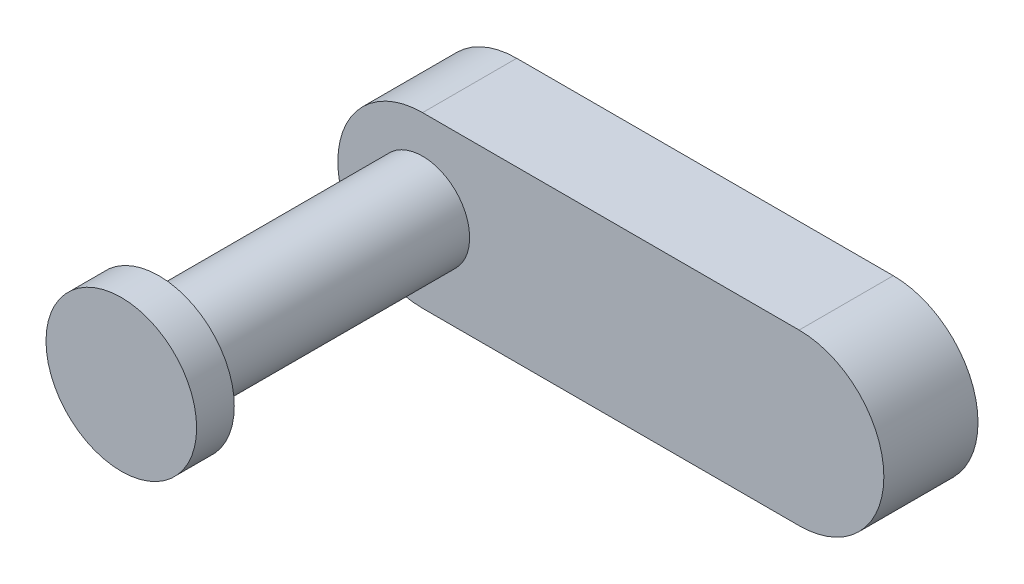
ISO-10303-21;
HEADER;
FILE_DESCRIPTION(('STEP AP214'),'2;1');
FILE_NAME('part.step','',(''),(''),'','','');
FILE_SCHEMA(('AUTOMOTIVE_DESIGN { 1 0 10303 214 1 1 1 1 }'));
ENDSEC;
DATA;
#1=APPLICATION_CONTEXT('core data for automotive mechanical design processes');
#2=APPLICATION_PROTOCOL_DEFINITION('international standard','automotive_design',2000,#1);
#3=PRODUCT_CONTEXT('',#1,'mechanical');
#4=PRODUCT('Part','Part','',(#3));
#5=PRODUCT_RELATED_PRODUCT_CATEGORY('part','',(#4));
#6=PRODUCT_DEFINITION_FORMATION('','',#4);
#7=PRODUCT_DEFINITION_CONTEXT('part definition',#1,'design');
#8=PRODUCT_DEFINITION('design','',#6,#7);
#9=PRODUCT_DEFINITION_SHAPE('','',#8);
#10=(LENGTH_UNIT() NAMED_UNIT(*) SI_UNIT(.MILLI.,.METRE.));
#11=(NAMED_UNIT(*) PLANE_ANGLE_UNIT() SI_UNIT($,.RADIAN.));
#12=(NAMED_UNIT(*) SI_UNIT($,.STERADIAN.) SOLID_ANGLE_UNIT());
#13=UNCERTAINTY_MEASURE_WITH_UNIT(LENGTH_MEASURE(1.E-05),#10,'distance_accuracy_value','');
#14=(GEOMETRIC_REPRESENTATION_CONTEXT(3) GLOBAL_UNCERTAINTY_ASSIGNED_CONTEXT((#13)) GLOBAL_UNIT_ASSIGNED_CONTEXT((#10,
#11,#12)) REPRESENTATION_CONTEXT('',''));
#15=CARTESIAN_POINT('',(0.,0.,0.));
#16=DIRECTION('',(0.,0.,1.));
#17=DIRECTION('',(1.,0.,0.));
#18=AXIS2_PLACEMENT_3D('',#15,#16,#17);
#19=CARTESIAN_POINT('',(0.,0.,26.67));
#20=DIRECTION('',(0.,0.,-1.));
#21=DIRECTION('',(-1.,0.,0.));
#22=AXIS2_PLACEMENT_3D('',#19,#20,#21);
#23=CYLINDRICAL_SURFACE('',#22,3.175);
#24=CARTESIAN_POINT('',(0.,0.,6.35));
#25=DIRECTION('',(0.,0.,-1.));
#26=DIRECTION('',(-1.,0.,0.));
#27=AXIS2_PLACEMENT_3D('',#24,#25,#26);
#28=CIRCLE('',#27,3.175);
#29=CARTESIAN_POINT('',(-3.175,0.,6.35));
#30=VERTEX_POINT('',#29);
#31=EDGE_CURVE('E43',#30,#30,#28,.F.);
#32=ORIENTED_EDGE('',*,*,#31,.T.);
#33=EDGE_LOOP('',(#32));
#34=FACE_BOUND('',#33,.T.);
#35=CARTESIAN_POINT('',(0.,0.,24.13));
#36=DIRECTION('',(0.,0.,1.));
#37=DIRECTION('',(1.,0.,0.));
#38=AXIS2_PLACEMENT_3D('',#35,#36,#37);
#39=CIRCLE('',#38,3.175);
#40=CARTESIAN_POINT('',(3.175,0.,24.13));
#41=VERTEX_POINT('',#40);
#42=EDGE_CURVE('E11',#41,#41,#39,.T.);
#43=ORIENTED_EDGE('',*,*,#42,.F.);
#44=EDGE_LOOP('',(#43));
#45=FACE_BOUND('',#44,.T.);
#46=ADVANCED_FACE('F34',(#34,#45),#23,.T.);
#47=CARTESIAN_POINT('',(0.,0.,6.35));
#48=DIRECTION('',(0.,0.,-1.));
#49=DIRECTION('',(-1.,0.,0.));
#50=AXIS2_PLACEMENT_3D('',#47,#48,#49);
#51=PLANE('',#50);
#52=CARTESIAN_POINT('',(0.,0.,6.35));
#53=DIRECTION('',(0.,0.,1.));
#54=DIRECTION('',(-1.,0.,0.));
#55=AXIS2_PLACEMENT_3D('',#52,#53,#54);
#56=CIRCLE('',#55,5.715);
#57=CARTESIAN_POINT('',(0.,5.715,6.35));
#58=VERTEX_POINT('',#57);
#59=CARTESIAN_POINT('',(0.,-5.715,6.35));
#60=VERTEX_POINT('',#59);
#61=EDGE_CURVE('E88',#58,#60,#56,.T.);
#62=ORIENTED_EDGE('',*,*,#61,.T.);
#63=DIRECTION('',(1.,0.,0.));
#64=VECTOR('',#63,1.);
#65=CARTESIAN_POINT('',(25.4,-5.715,6.35));
#66=LINE('',#65,#64);
#67=CARTESIAN_POINT('',(25.4,-5.715,6.35));
#68=VERTEX_POINT('',#67);
#69=EDGE_CURVE('E82',#60,#68,#66,.T.);
#70=ORIENTED_EDGE('',*,*,#69,.T.);
#71=CARTESIAN_POINT('',(25.4,0.,6.35));
#72=DIRECTION('',(0.,0.,1.));
#73=DIRECTION('',(-1.,0.,0.));
#74=AXIS2_PLACEMENT_3D('',#71,#72,#73);
#75=CIRCLE('',#74,5.715);
#76=CARTESIAN_POINT('',(25.4,5.715,6.35));
#77=VERTEX_POINT('',#76);
#78=EDGE_CURVE('E86',#68,#77,#75,.T.);
#79=ORIENTED_EDGE('',*,*,#78,.T.);
#80=DIRECTION('',(-1.,0.,0.));
#81=VECTOR('',#80,1.);
#82=CARTESIAN_POINT('',(0.,5.715,6.35));
#83=LINE('',#82,#81);
#84=EDGE_CURVE('E51',#77,#58,#83,.T.);
#85=ORIENTED_EDGE('',*,*,#84,.T.);
#86=EDGE_LOOP('',(#62,#70,#79,#85));
#87=FACE_BOUND('',#86,.T.);
#88=ORIENTED_EDGE('',*,*,#31,.F.);
#89=EDGE_LOOP('',(#88));
#90=FACE_BOUND('',#89,.T.);
#91=ADVANCED_FACE('F83',(#87,#90),#51,.F.);
#92=CARTESIAN_POINT('',(0.,0.,6.35));
#93=DIRECTION('',(0.,0.,-1.));
#94=DIRECTION('',(-1.,0.,0.));
#95=AXIS2_PLACEMENT_3D('',#92,#93,#94);
#96=CYLINDRICAL_SURFACE('',#95,5.715);
#97=CARTESIAN_POINT('',(0.,0.,0.));
#98=DIRECTION('',(0.,0.,1.));
#99=DIRECTION('',(-1.,0.,0.));
#100=AXIS2_PLACEMENT_3D('',#97,#98,#99);
#101=CIRCLE('',#100,5.715);
#102=CARTESIAN_POINT('',(0.,5.715,0.));
#103=VERTEX_POINT('',#102);
#104=CARTESIAN_POINT('',(0.,-5.715,0.));
#105=VERTEX_POINT('',#104);
#106=EDGE_CURVE('E103',#103,#105,#101,.T.);
#107=ORIENTED_EDGE('',*,*,#106,.T.);
#108=DIRECTION('',(0.,0.,-1.));
#109=VECTOR('',#108,1.);
#110=CARTESIAN_POINT('',(0.,-5.715,6.35));
#111=LINE('',#110,#109);
#112=EDGE_CURVE('E94',#60,#105,#111,.T.);
#113=ORIENTED_EDGE('',*,*,#112,.F.);
#114=ORIENTED_EDGE('',*,*,#61,.F.);
#115=DIRECTION('',(0.,0.,-1.));
#116=VECTOR('',#115,1.);
#117=CARTESIAN_POINT('',(0.,5.715,6.35));
#118=LINE('',#117,#116);
#119=EDGE_CURVE('E99',#58,#103,#118,.T.);
#120=ORIENTED_EDGE('',*,*,#119,.T.);
#121=EDGE_LOOP('',(#107,#113,#114,#120));
#122=FACE_BOUND('',#121,.T.);
#123=ADVANCED_FACE('F36',(#122),#96,.T.);
#124=CARTESIAN_POINT('',(25.4,-5.715,6.35));
#125=DIRECTION('',(0.,1.,0.));
#126=DIRECTION('',(-1.,0.,0.));
#127=AXIS2_PLACEMENT_3D('',#124,#125,#126);
#128=PLANE('',#127);
#129=DIRECTION('',(1.,0.,0.));
#130=VECTOR('',#129,1.);
#131=CARTESIAN_POINT('',(25.4,-5.715,0.));
#132=LINE('',#131,#130);
#133=CARTESIAN_POINT('',(25.4,-5.715,0.));
#134=VERTEX_POINT('',#133);
#135=EDGE_CURVE('E93',#105,#134,#132,.T.);
#136=ORIENTED_EDGE('',*,*,#135,.T.);
#137=DIRECTION('',(0.,0.,-1.));
#138=VECTOR('',#137,1.);
#139=CARTESIAN_POINT('',(25.4,-5.715,6.35));
#140=LINE('',#139,#138);
#141=EDGE_CURVE('E91',#68,#134,#140,.T.);
#142=ORIENTED_EDGE('',*,*,#141,.F.);
#143=ORIENTED_EDGE('',*,*,#69,.F.);
#144=ORIENTED_EDGE('',*,*,#112,.T.);
#145=EDGE_LOOP('',(#136,#142,#143,#144));
#146=FACE_BOUND('',#145,.T.);
#147=ADVANCED_FACE('F92',(#146),#128,.F.);
#148=CARTESIAN_POINT('',(25.4,0.,6.35));
#149=DIRECTION('',(0.,0.,-1.));
#150=DIRECTION('',(-1.,0.,0.));
#151=AXIS2_PLACEMENT_3D('',#148,#149,#150);
#152=CYLINDRICAL_SURFACE('',#151,5.715);
#153=CARTESIAN_POINT('',(25.4,0.,0.));
#154=DIRECTION('',(0.,0.,1.));
#155=DIRECTION('',(-1.,0.,0.));
#156=AXIS2_PLACEMENT_3D('',#153,#154,#155);
#157=CIRCLE('',#156,5.715);
#158=CARTESIAN_POINT('',(25.4,5.715,0.));
#159=VERTEX_POINT('',#158);
#160=EDGE_CURVE('E68',#134,#159,#157,.T.);
#161=ORIENTED_EDGE('',*,*,#160,.T.);
#162=DIRECTION('',(0.,0.,-1.));
#163=VECTOR('',#162,1.);
#164=CARTESIAN_POINT('',(25.4,5.715,6.35));
#165=LINE('',#164,#163);
#166=EDGE_CURVE('E95',#77,#159,#165,.T.);
#167=ORIENTED_EDGE('',*,*,#166,.F.);
#168=ORIENTED_EDGE('',*,*,#78,.F.);
#169=ORIENTED_EDGE('',*,*,#141,.T.);
#170=EDGE_LOOP('',(#161,#167,#168,#169));
#171=FACE_BOUND('',#170,.T.);
#172=ADVANCED_FACE('F97',(#171),#152,.T.);
#173=CARTESIAN_POINT('',(0.,5.715,6.35));
#174=DIRECTION('',(0.,-1.,0.));
#175=DIRECTION('',(0.,0.,-1.));
#176=AXIS2_PLACEMENT_3D('',#173,#174,#175);
#177=PLANE('',#176);
#178=DIRECTION('',(-1.,0.,0.));
#179=VECTOR('',#178,1.);
#180=CARTESIAN_POINT('',(0.,5.715,0.));
#181=LINE('',#180,#179);
#182=EDGE_CURVE('E74',#159,#103,#181,.T.);
#183=ORIENTED_EDGE('',*,*,#182,.T.);
#184=ORIENTED_EDGE('',*,*,#119,.F.);
#185=ORIENTED_EDGE('',*,*,#84,.F.);
#186=ORIENTED_EDGE('',*,*,#166,.T.);
#187=EDGE_LOOP('',(#183,#184,#185,#186));
#188=FACE_BOUND('',#187,.T.);
#189=ADVANCED_FACE('F130',(#188),#177,.F.);
#190=CARTESIAN_POINT('',(0.,0.,0.));
#191=DIRECTION('',(0.,0.,-1.));
#192=DIRECTION('',(-1.,0.,0.));
#193=AXIS2_PLACEMENT_3D('',#190,#191,#192);
#194=PLANE('',#193);
#195=ORIENTED_EDGE('',*,*,#106,.F.);
#196=ORIENTED_EDGE('',*,*,#182,.F.);
#197=ORIENTED_EDGE('',*,*,#160,.F.);
#198=ORIENTED_EDGE('',*,*,#135,.F.);
#199=EDGE_LOOP('',(#195,#196,#197,#198));
#200=FACE_BOUND('',#199,.T.);
#201=ADVANCED_FACE('F126',(#200),#194,.T.);
#202=CARTESIAN_POINT('',(0.,0.,24.13));
#203=DIRECTION('',(0.,0.,1.));
#204=DIRECTION('',(1.,0.,0.));
#205=AXIS2_PLACEMENT_3D('',#202,#203,#204);
#206=PLANE('',#205);
#207=CARTESIAN_POINT('',(0.,0.,24.13));
#208=DIRECTION('',(0.,0.,1.));
#209=DIRECTION('',(1.,0.,0.));
#210=AXIS2_PLACEMENT_3D('',#207,#208,#209);
#211=CIRCLE('',#210,5.08);
#212=CARTESIAN_POINT('',(5.08,0.,24.13));
#213=VERTEX_POINT('',#212);
#214=EDGE_CURVE('E106',#213,#213,#211,.T.);
#215=ORIENTED_EDGE('',*,*,#214,.F.);
#216=EDGE_LOOP('',(#215));
#217=FACE_BOUND('',#216,.T.);
#218=ORIENTED_EDGE('',*,*,#42,.T.);
#219=EDGE_LOOP('',(#218));
#220=FACE_BOUND('',#219,.T.);
#221=ADVANCED_FACE('F129',(#217,#220),#206,.F.);
#222=CARTESIAN_POINT('',(0.,0.,24.13));
#223=DIRECTION('',(0.,0.,1.));
#224=DIRECTION('',(1.,0.,0.));
#225=AXIS2_PLACEMENT_3D('',#222,#223,#224);
#226=CYLINDRICAL_SURFACE('',#225,5.08);
#227=ORIENTED_EDGE('',*,*,#214,.T.);
#228=EDGE_LOOP('',(#227));
#229=FACE_BOUND('',#228,.T.);
#230=CARTESIAN_POINT('',(0.,0.,26.67));
#231=DIRECTION('',(0.,0.,1.));
#232=DIRECTION('',(1.,0.,0.));
#233=AXIS2_PLACEMENT_3D('',#230,#231,#232);
#234=CIRCLE('',#233,5.08);
#235=CARTESIAN_POINT('',(5.08,0.,26.67));
#236=VERTEX_POINT('',#235);
#237=EDGE_CURVE('E209',#236,#236,#234,.T.);
#238=ORIENTED_EDGE('',*,*,#237,.F.);
#239=EDGE_LOOP('',(#238));
#240=FACE_BOUND('',#239,.T.);
#241=ADVANCED_FACE('F158',(#229,#240),#226,.T.);
#242=CARTESIAN_POINT('',(0.,0.,26.67));
#243=DIRECTION('',(0.,0.,1.));
#244=DIRECTION('',(1.,0.,0.));
#245=AXIS2_PLACEMENT_3D('',#242,#243,#244);
#246=PLANE('',#245);
#247=ORIENTED_EDGE('',*,*,#237,.T.);
#248=EDGE_LOOP('',(#247));
#249=FACE_BOUND('',#248,.T.);
#250=ADVANCED_FACE('F167',(#249),#246,.T.);
#251=CLOSED_SHELL('',(#46,#91,#123,#147,#172,#189,#201,#221,#241,#250));
#252=MANIFOLD_SOLID_BREP('B2',#251);
#253=ADVANCED_BREP_SHAPE_REPRESENTATION('',(#18,#252),#14);
#254=SHAPE_DEFINITION_REPRESENTATION(#9,#253);
ENDSEC;
END-ISO-10303-21;
